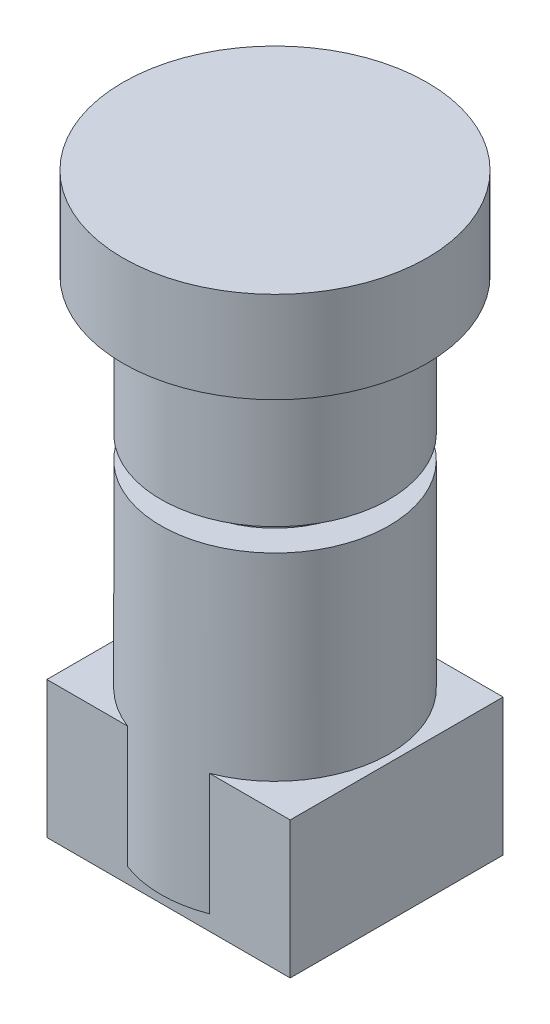
ISO-10303-21;
HEADER;
FILE_DESCRIPTION(('STEP AP214'),'2;1');
FILE_NAME('part.step','',(''),(''),'','','');
FILE_SCHEMA(('AUTOMOTIVE_DESIGN { 1 0 10303 214 1 1 1 1 }'));
ENDSEC;
DATA;
#1=APPLICATION_CONTEXT('core data for automotive mechanical design processes');
#2=APPLICATION_PROTOCOL_DEFINITION('international standard','automotive_design',2000,#1);
#3=PRODUCT_CONTEXT('',#1,'mechanical');
#4=PRODUCT('Part','Part','',(#3));
#5=PRODUCT_RELATED_PRODUCT_CATEGORY('part','',(#4));
#6=PRODUCT_DEFINITION_FORMATION('','',#4);
#7=PRODUCT_DEFINITION_CONTEXT('part definition',#1,'design');
#8=PRODUCT_DEFINITION('design','',#6,#7);
#9=PRODUCT_DEFINITION_SHAPE('','',#8);
#10=(LENGTH_UNIT() NAMED_UNIT(*) SI_UNIT(.MILLI.,.METRE.));
#11=(NAMED_UNIT(*) PLANE_ANGLE_UNIT() SI_UNIT($,.RADIAN.));
#12=(NAMED_UNIT(*) SI_UNIT($,.STERADIAN.) SOLID_ANGLE_UNIT());
#13=UNCERTAINTY_MEASURE_WITH_UNIT(LENGTH_MEASURE(1.E-05),#10,'distance_accuracy_value','');
#14=(GEOMETRIC_REPRESENTATION_CONTEXT(3) GLOBAL_UNCERTAINTY_ASSIGNED_CONTEXT((#13)) GLOBAL_UNIT_ASSIGNED_CONTEXT((#10,
#11,#12)) REPRESENTATION_CONTEXT('',''));
#15=CARTESIAN_POINT('',(0.,0.,0.));
#16=DIRECTION('',(0.,0.,1.));
#17=DIRECTION('',(1.,0.,0.));
#18=AXIS2_PLACEMENT_3D('',#15,#16,#17);
#19=CARTESIAN_POINT('',(0.,2.,0.));
#20=DIRECTION('',(0.,-1.,0.));
#21=DIRECTION('',(0.,0.,-1.));
#22=AXIS2_PLACEMENT_3D('',#19,#20,#21);
#23=PLANE('',#22);
#24=CARTESIAN_POINT('',(0.,2.,0.));
#25=DIRECTION('',(0.,-1.,0.));
#26=DIRECTION('',(0.,0.,-1.));
#27=AXIS2_PLACEMENT_3D('',#24,#25,#26);
#28=CIRCLE('',#27,15.);
#29=CARTESIAN_POINT('',(5.3851648071345,2.,14.));
#30=VERTEX_POINT('',#29);
#31=CARTESIAN_POINT('',(-5.3851648071345,2.,14.));
#32=VERTEX_POINT('',#31);
#33=EDGE_CURVE('E163',#30,#32,#28,.T.);
#34=ORIENTED_EDGE('',*,*,#33,.T.);
#35=DIRECTION('',(1.,0.,0.));
#36=VECTOR('',#35,1.);
#37=CARTESIAN_POINT('',(0.,2.,14.));
#38=LINE('',#37,#36);
#39=EDGE_CURVE('E135',#32,#30,#38,.T.);
#40=ORIENTED_EDGE('',*,*,#39,.T.);
#41=EDGE_LOOP('',(#34,#40));
#42=FACE_BOUND('',#41,.T.);
#43=ADVANCED_FACE('F43',(#42),#23,.T.);
#44=CARTESIAN_POINT('',(-5.3851648071345,2.,-14.));
#45=VERTEX_POINT('',#44);
#46=CARTESIAN_POINT('',(5.3851648071345,2.,-14.));
#47=VERTEX_POINT('',#46);
#48=EDGE_CURVE('E161',#45,#47,#28,.T.);
#49=ORIENTED_EDGE('',*,*,#48,.T.);
#50=DIRECTION('',(-1.,0.,0.));
#51=VECTOR('',#50,1.);
#52=CARTESIAN_POINT('',(0.,2.,-14.));
#53=LINE('',#52,#51);
#54=EDGE_CURVE('E129',#47,#45,#53,.T.);
#55=ORIENTED_EDGE('',*,*,#54,.T.);
#56=EDGE_LOOP('',(#49,#55));
#57=FACE_BOUND('',#56,.T.);
#58=ADVANCED_FACE('F206',(#57),#23,.T.);
#59=CARTESIAN_POINT('',(0.,-3.,0.));
#60=DIRECTION('',(0.,-1.,0.));
#61=DIRECTION('',(0.,0.,-1.));
#62=AXIS2_PLACEMENT_3D('',#59,#60,#61);
#63=CYLINDRICAL_SURFACE('',#62,15.);
#64=CARTESIAN_POINT('',(0.,44.,0.));
#65=DIRECTION('',(0.,-1.,0.));
#66=DIRECTION('',(0.,0.,-1.));
#67=AXIS2_PLACEMENT_3D('',#64,#65,#66);
#68=CIRCLE('',#67,15.);
#69=CARTESIAN_POINT('',(0.,44.,-15.));
#70=VERTEX_POINT('',#69);
#71=EDGE_CURVE('E158',#70,#70,#68,.T.);
#72=ORIENTED_EDGE('',*,*,#71,.T.);
#73=EDGE_LOOP('',(#72));
#74=FACE_BOUND('',#73,.T.);
#75=CARTESIAN_POINT('',(0.,18.,0.));
#76=DIRECTION('',(0.,1.,0.));
#77=DIRECTION('',(0.,0.,1.));
#78=AXIS2_PLACEMENT_3D('',#75,#76,#77);
#79=CIRCLE('',#78,15.);
#80=CARTESIAN_POINT('',(-5.3851648071345,18.,14.));
#81=VERTEX_POINT('',#80);
#82=CARTESIAN_POINT('',(-5.3851648071345,18.,-14.));
#83=VERTEX_POINT('',#82);
#84=EDGE_CURVE('E56',#81,#83,#79,.F.);
#85=ORIENTED_EDGE('',*,*,#84,.F.);
#86=DIRECTION('',(0.,-1.,0.));
#87=VECTOR('',#86,1.);
#88=CARTESIAN_POINT('',(-5.3851648071345,-3.,14.));
#89=LINE('',#88,#87);
#90=EDGE_CURVE('E11',#81,#32,#89,.T.);
#91=ORIENTED_EDGE('',*,*,#90,.T.);
#92=ORIENTED_EDGE('',*,*,#33,.F.);
#93=DIRECTION('',(0.,-1.,0.));
#94=VECTOR('',#93,1.);
#95=CARTESIAN_POINT('',(5.3851648071345,-3.,14.));
#96=LINE('',#95,#94);
#97=CARTESIAN_POINT('',(5.3851648071345,18.,14.));
#98=VERTEX_POINT('',#97);
#99=EDGE_CURVE('E168',#30,#98,#96,.F.);
#100=ORIENTED_EDGE('',*,*,#99,.T.);
#101=CARTESIAN_POINT('',(5.3851648071345,18.,-14.));
#102=VERTEX_POINT('',#101);
#103=EDGE_CURVE('E164',#102,#98,#79,.F.);
#104=ORIENTED_EDGE('',*,*,#103,.F.);
#105=DIRECTION('',(0.,-1.,0.));
#106=VECTOR('',#105,1.);
#107=CARTESIAN_POINT('',(5.3851648071345,-3.,-14.));
#108=LINE('',#107,#106);
#109=EDGE_CURVE('E169',#102,#47,#108,.T.);
#110=ORIENTED_EDGE('',*,*,#109,.T.);
#111=ORIENTED_EDGE('',*,*,#48,.F.);
#112=DIRECTION('',(0.,-1.,0.));
#113=VECTOR('',#112,1.);
#114=CARTESIAN_POINT('',(-5.3851648071345,-3.,-14.));
#115=LINE('',#114,#113);
#116=EDGE_CURVE('E49',#45,#83,#115,.F.);
#117=ORIENTED_EDGE('',*,*,#116,.T.);
#118=EDGE_LOOP('',(#85,#91,#92,#100,#104,#110,#111,#117));
#119=FACE_BOUND('',#118,.T.);
#120=ADVANCED_FACE('F205',(#74,#119),#63,.T.);
#121=CARTESIAN_POINT('',(15.,44.,0.));
#122=DIRECTION('',(0.,1.,0.));
#123=DIRECTION('',(0.,0.,1.));
#124=AXIS2_PLACEMENT_3D('',#121,#122,#123);
#125=PLANE('',#124);
#126=CARTESIAN_POINT('',(0.,44.,0.));
#127=DIRECTION('',(0.,-1.,0.));
#128=DIRECTION('',(0.,0.,-1.));
#129=AXIS2_PLACEMENT_3D('',#126,#127,#128);
#130=CIRCLE('',#129,11.);
#131=CARTESIAN_POINT('',(0.,44.,-11.));
#132=VERTEX_POINT('',#131);
#133=EDGE_CURVE('E154',#132,#132,#130,.T.);
#134=ORIENTED_EDGE('',*,*,#133,.T.);
#135=EDGE_LOOP('',(#134));
#136=FACE_BOUND('',#135,.T.);
#137=ORIENTED_EDGE('',*,*,#71,.F.);
#138=EDGE_LOOP('',(#137));
#139=FACE_BOUND('',#138,.T.);
#140=ADVANCED_FACE('F212',(#136,#139),#125,.T.);
#141=CARTESIAN_POINT('',(0.,-3.,0.));
#142=DIRECTION('',(0.,-1.,0.));
#143=DIRECTION('',(0.,0.,-1.));
#144=AXIS2_PLACEMENT_3D('',#141,#142,#143);
#145=CYLINDRICAL_SURFACE('',#144,11.);
#146=CARTESIAN_POINT('',(0.,47.,0.));
#147=DIRECTION('',(0.,-1.,0.));
#148=DIRECTION('',(0.,0.,-1.));
#149=AXIS2_PLACEMENT_3D('',#146,#147,#148);
#150=CIRCLE('',#149,11.);
#151=CARTESIAN_POINT('',(0.,47.,-11.));
#152=VERTEX_POINT('',#151);
#153=EDGE_CURVE('E155',#152,#152,#150,.T.);
#154=ORIENTED_EDGE('',*,*,#153,.T.);
#155=EDGE_LOOP('',(#154));
#156=FACE_BOUND('',#155,.T.);
#157=ORIENTED_EDGE('',*,*,#133,.F.);
#158=EDGE_LOOP('',(#157));
#159=FACE_BOUND('',#158,.T.);
#160=ADVANCED_FACE('F218',(#156,#159),#145,.T.);
#161=CARTESIAN_POINT('',(11.,47.,0.));
#162=DIRECTION('',(0.,-1.,0.));
#163=DIRECTION('',(0.,0.,-1.));
#164=AXIS2_PLACEMENT_3D('',#161,#162,#163);
#165=PLANE('',#164);
#166=CARTESIAN_POINT('',(0.,47.,0.));
#167=DIRECTION('',(0.,-1.,0.));
#168=DIRECTION('',(0.,0.,-1.));
#169=AXIS2_PLACEMENT_3D('',#166,#167,#168);
#170=CIRCLE('',#169,15.);
#171=CARTESIAN_POINT('',(0.,47.,-15.));
#172=VERTEX_POINT('',#171);
#173=EDGE_CURVE('E149',#172,#172,#170,.T.);
#174=ORIENTED_EDGE('',*,*,#173,.T.);
#175=EDGE_LOOP('',(#174));
#176=FACE_BOUND('',#175,.T.);
#177=ORIENTED_EDGE('',*,*,#153,.F.);
#178=EDGE_LOOP('',(#177));
#179=FACE_BOUND('',#178,.T.);
#180=ADVANCED_FACE('F223',(#176,#179),#165,.T.);
#181=CARTESIAN_POINT('',(0.,-3.,0.));
#182=DIRECTION('',(0.,-1.,0.));
#183=DIRECTION('',(0.,0.,-1.));
#184=AXIS2_PLACEMENT_3D('',#181,#182,#183);
#185=CYLINDRICAL_SURFACE('',#184,15.);
#186=CARTESIAN_POINT('',(0.,65.,0.));
#187=DIRECTION('',(0.,-1.,0.));
#188=DIRECTION('',(0.,0.,-1.));
#189=AXIS2_PLACEMENT_3D('',#186,#187,#188);
#190=CIRCLE('',#189,15.);
#191=CARTESIAN_POINT('',(0.,65.,-15.));
#192=VERTEX_POINT('',#191);
#193=EDGE_CURVE('E148',#192,#192,#190,.T.);
#194=ORIENTED_EDGE('',*,*,#193,.T.);
#195=EDGE_LOOP('',(#194));
#196=FACE_BOUND('',#195,.T.);
#197=ORIENTED_EDGE('',*,*,#173,.F.);
#198=EDGE_LOOP('',(#197));
#199=FACE_BOUND('',#198,.T.);
#200=ADVANCED_FACE('F226',(#196,#199),#185,.T.);
#201=CARTESIAN_POINT('',(15.,65.,0.));
#202=DIRECTION('',(0.,-1.,0.));
#203=DIRECTION('',(0.,0.,-1.));
#204=AXIS2_PLACEMENT_3D('',#201,#202,#203);
#205=PLANE('',#204);
#206=CARTESIAN_POINT('',(0.,65.,0.));
#207=DIRECTION('',(0.,-1.,0.));
#208=DIRECTION('',(0.,0.,-1.));
#209=AXIS2_PLACEMENT_3D('',#206,#207,#208);
#210=CIRCLE('',#209,20.);
#211=CARTESIAN_POINT('',(0.,65.,-20.));
#212=VERTEX_POINT('',#211);
#213=EDGE_CURVE('E141',#212,#212,#210,.T.);
#214=ORIENTED_EDGE('',*,*,#213,.T.);
#215=EDGE_LOOP('',(#214));
#216=FACE_BOUND('',#215,.T.);
#217=ORIENTED_EDGE('',*,*,#193,.F.);
#218=EDGE_LOOP('',(#217));
#219=FACE_BOUND('',#218,.T.);
#220=ADVANCED_FACE('F232',(#216,#219),#205,.T.);
#221=CARTESIAN_POINT('',(0.,-3.,0.));
#222=DIRECTION('',(0.,-1.,0.));
#223=DIRECTION('',(0.,0.,-1.));
#224=AXIS2_PLACEMENT_3D('',#221,#222,#223);
#225=CYLINDRICAL_SURFACE('',#224,20.);
#226=CARTESIAN_POINT('',(0.,77.,0.));
#227=DIRECTION('',(0.,-1.,0.));
#228=DIRECTION('',(0.,0.,-1.));
#229=AXIS2_PLACEMENT_3D('',#226,#227,#228);
#230=CIRCLE('',#229,20.);
#231=CARTESIAN_POINT('',(0.,77.,-20.));
#232=VERTEX_POINT('',#231);
#233=EDGE_CURVE('E139',#232,#232,#230,.T.);
#234=ORIENTED_EDGE('',*,*,#233,.T.);
#235=EDGE_LOOP('',(#234));
#236=FACE_BOUND('',#235,.T.);
#237=ORIENTED_EDGE('',*,*,#213,.F.);
#238=EDGE_LOOP('',(#237));
#239=FACE_BOUND('',#238,.T.);
#240=ADVANCED_FACE('F240',(#236,#239),#225,.T.);
#241=CARTESIAN_POINT('',(20.,77.,0.));
#242=DIRECTION('',(0.,1.,0.));
#243=DIRECTION('',(0.,0.,1.));
#244=AXIS2_PLACEMENT_3D('',#241,#242,#243);
#245=PLANE('',#244);
#246=ORIENTED_EDGE('',*,*,#233,.F.);
#247=EDGE_LOOP('',(#246));
#248=FACE_BOUND('',#247,.T.);
#249=ADVANCED_FACE('F242',(#248),#245,.T.);
#250=CARTESIAN_POINT('',(0.,18.,0.));
#251=DIRECTION('',(0.,1.,0.));
#252=DIRECTION('',(0.,0.,1.));
#253=AXIS2_PLACEMENT_3D('',#250,#251,#252);
#254=PLANE('',#253);
#255=DIRECTION('',(1.,0.,0.));
#256=VECTOR('',#255,1.);
#257=CARTESIAN_POINT('',(-16.,18.,14.));
#258=LINE('',#257,#256);
#259=CARTESIAN_POINT('',(-16.,18.,14.));
#260=VERTEX_POINT('',#259);
#261=EDGE_CURVE('E102',#260,#81,#258,.T.);
#262=ORIENTED_EDGE('',*,*,#261,.T.);
#263=ORIENTED_EDGE('',*,*,#84,.T.);
#264=DIRECTION('',(-1.,0.,0.));
#265=VECTOR('',#264,1.);
#266=CARTESIAN_POINT('',(16.,18.,-14.));
#267=LINE('',#266,#265);
#268=CARTESIAN_POINT('',(-16.,18.,-14.));
#269=VERTEX_POINT('',#268);
#270=EDGE_CURVE('E118',#83,#269,#267,.T.);
#271=ORIENTED_EDGE('',*,*,#270,.T.);
#272=DIRECTION('',(0.,0.,1.));
#273=VECTOR('',#272,1.);
#274=CARTESIAN_POINT('',(-16.,18.,-14.));
#275=LINE('',#274,#273);
#276=EDGE_CURVE('E120',#269,#260,#275,.T.);
#277=ORIENTED_EDGE('',*,*,#276,.T.);
#278=EDGE_LOOP('',(#262,#263,#271,#277));
#279=FACE_BOUND('',#278,.T.);
#280=ADVANCED_FACE('F119',(#279),#254,.T.);
#281=CARTESIAN_POINT('',(-16.,18.,-14.));
#282=DIRECTION('',(1.,0.,0.));
#283=DIRECTION('',(0.,0.,-1.));
#284=AXIS2_PLACEMENT_3D('',#281,#282,#283);
#285=PLANE('',#284);
#286=DIRECTION('',(0.,0.,1.));
#287=VECTOR('',#286,1.);
#288=CARTESIAN_POINT('',(-16.,0.,-14.));
#289=LINE('',#288,#287);
#290=CARTESIAN_POINT('',(-16.,0.,-14.));
#291=VERTEX_POINT('',#290);
#292=CARTESIAN_POINT('',(-16.,0.,14.));
#293=VERTEX_POINT('',#292);
#294=EDGE_CURVE('E126',#291,#293,#289,.T.);
#295=ORIENTED_EDGE('',*,*,#294,.T.);
#296=DIRECTION('',(0.,-1.,0.));
#297=VECTOR('',#296,1.);
#298=CARTESIAN_POINT('',(-16.,18.,14.));
#299=LINE('',#298,#297);
#300=EDGE_CURVE('E108',#260,#293,#299,.T.);
#301=ORIENTED_EDGE('',*,*,#300,.F.);
#302=ORIENTED_EDGE('',*,*,#276,.F.);
#303=DIRECTION('',(0.,-1.,0.));
#304=VECTOR('',#303,1.);
#305=CARTESIAN_POINT('',(-16.,18.,-14.));
#306=LINE('',#305,#304);
#307=EDGE_CURVE('E171',#269,#291,#306,.T.);
#308=ORIENTED_EDGE('',*,*,#307,.T.);
#309=EDGE_LOOP('',(#295,#301,#302,#308));
#310=FACE_BOUND('',#309,.T.);
#311=ADVANCED_FACE('F127',(#310),#285,.F.);
#312=CARTESIAN_POINT('',(-16.,18.,14.));
#313=DIRECTION('',(0.,0.,-1.));
#314=DIRECTION('',(-1.,0.,0.));
#315=AXIS2_PLACEMENT_3D('',#312,#313,#314);
#316=PLANE('',#315);
#317=ORIENTED_EDGE('',*,*,#99,.F.);
#318=ORIENTED_EDGE('',*,*,#39,.F.);
#319=ORIENTED_EDGE('',*,*,#90,.F.);
#320=ORIENTED_EDGE('',*,*,#261,.F.);
#321=ORIENTED_EDGE('',*,*,#300,.T.);
#322=DIRECTION('',(1.,0.,0.));
#323=VECTOR('',#322,1.);
#324=CARTESIAN_POINT('',(-16.,0.,14.));
#325=LINE('',#324,#323);
#326=CARTESIAN_POINT('',(16.,0.,14.));
#327=VERTEX_POINT('',#326);
#328=EDGE_CURVE('E182',#293,#327,#325,.T.);
#329=ORIENTED_EDGE('',*,*,#328,.T.);
#330=DIRECTION('',(0.,-1.,0.));
#331=VECTOR('',#330,1.);
#332=CARTESIAN_POINT('',(16.,18.,14.));
#333=LINE('',#332,#331);
#334=CARTESIAN_POINT('',(16.,18.,14.));
#335=VERTEX_POINT('',#334);
#336=EDGE_CURVE('E128',#335,#327,#333,.T.);
#337=ORIENTED_EDGE('',*,*,#336,.F.);
#338=EDGE_CURVE('E111',#98,#335,#258,.T.);
#339=ORIENTED_EDGE('',*,*,#338,.F.);
#340=EDGE_LOOP('',(#317,#318,#319,#320,#321,#329,#337,#339));
#341=FACE_BOUND('',#340,.T.);
#342=ADVANCED_FACE('F110',(#341),#316,.F.);
#343=CARTESIAN_POINT('',(16.,18.,14.));
#344=DIRECTION('',(-1.,0.,0.));
#345=DIRECTION('',(0.,0.,1.));
#346=AXIS2_PLACEMENT_3D('',#343,#344,#345);
#347=PLANE('',#346);
#348=DIRECTION('',(0.,0.,-1.));
#349=VECTOR('',#348,1.);
#350=CARTESIAN_POINT('',(16.,0.,14.));
#351=LINE('',#350,#349);
#352=CARTESIAN_POINT('',(16.,0.,-14.));
#353=VERTEX_POINT('',#352);
#354=EDGE_CURVE('E181',#327,#353,#351,.T.);
#355=ORIENTED_EDGE('',*,*,#354,.T.);
#356=DIRECTION('',(0.,-1.,0.));
#357=VECTOR('',#356,1.);
#358=CARTESIAN_POINT('',(16.,18.,-14.));
#359=LINE('',#358,#357);
#360=CARTESIAN_POINT('',(16.,18.,-14.));
#361=VERTEX_POINT('',#360);
#362=EDGE_CURVE('E133',#361,#353,#359,.T.);
#363=ORIENTED_EDGE('',*,*,#362,.F.);
#364=DIRECTION('',(0.,0.,-1.));
#365=VECTOR('',#364,1.);
#366=CARTESIAN_POINT('',(16.,18.,14.));
#367=LINE('',#366,#365);
#368=EDGE_CURVE('E114',#335,#361,#367,.T.);
#369=ORIENTED_EDGE('',*,*,#368,.F.);
#370=ORIENTED_EDGE('',*,*,#336,.T.);
#371=EDGE_LOOP('',(#355,#363,#369,#370));
#372=FACE_BOUND('',#371,.T.);
#373=ADVANCED_FACE('F196',(#372),#347,.F.);
#374=CARTESIAN_POINT('',(16.,18.,-14.));
#375=DIRECTION('',(0.,0.,1.));
#376=DIRECTION('',(1.,0.,0.));
#377=AXIS2_PLACEMENT_3D('',#374,#375,#376);
#378=PLANE('',#377);
#379=ORIENTED_EDGE('',*,*,#116,.F.);
#380=ORIENTED_EDGE('',*,*,#54,.F.);
#381=ORIENTED_EDGE('',*,*,#109,.F.);
#382=EDGE_CURVE('E173',#361,#102,#267,.T.);
#383=ORIENTED_EDGE('',*,*,#382,.F.);
#384=ORIENTED_EDGE('',*,*,#362,.T.);
#385=DIRECTION('',(-1.,0.,0.));
#386=VECTOR('',#385,1.);
#387=CARTESIAN_POINT('',(16.,0.,-14.));
#388=LINE('',#387,#386);
#389=EDGE_CURVE('E123',#353,#291,#388,.T.);
#390=ORIENTED_EDGE('',*,*,#389,.T.);
#391=ORIENTED_EDGE('',*,*,#307,.F.);
#392=ORIENTED_EDGE('',*,*,#270,.F.);
#393=EDGE_LOOP('',(#379,#380,#381,#383,#384,#390,#391,#392));
#394=FACE_BOUND('',#393,.T.);
#395=ADVANCED_FACE('F175',(#394),#378,.F.);
#396=ORIENTED_EDGE('',*,*,#382,.T.);
#397=ORIENTED_EDGE('',*,*,#103,.T.);
#398=ORIENTED_EDGE('',*,*,#338,.T.);
#399=ORIENTED_EDGE('',*,*,#368,.T.);
#400=EDGE_LOOP('',(#396,#397,#398,#399));
#401=FACE_BOUND('',#400,.T.);
#402=ADVANCED_FACE('F199',(#401),#254,.T.);
#403=CARTESIAN_POINT('',(0.,0.,0.));
#404=DIRECTION('',(0.,1.,0.));
#405=DIRECTION('',(0.,0.,1.));
#406=AXIS2_PLACEMENT_3D('',#403,#404,#405);
#407=PLANE('',#406);
#408=ORIENTED_EDGE('',*,*,#294,.F.);
#409=ORIENTED_EDGE('',*,*,#389,.F.);
#410=ORIENTED_EDGE('',*,*,#354,.F.);
#411=ORIENTED_EDGE('',*,*,#328,.F.);
#412=EDGE_LOOP('',(#408,#409,#410,#411));
#413=FACE_BOUND('',#412,.T.);
#414=ADVANCED_FACE('F194',(#413),#407,.F.);
#415=CLOSED_SHELL('',(#43,#58,#120,#140,#160,#180,#200,#220,#240,#249,#280,#311,#342,#373,#395,
#402,#414));
#416=MANIFOLD_SOLID_BREP('B2',#415);
#417=ADVANCED_BREP_SHAPE_REPRESENTATION('',(#18,#416),#14);
#418=SHAPE_DEFINITION_REPRESENTATION(#9,#417);
ENDSEC;
END-ISO-10303-21;
